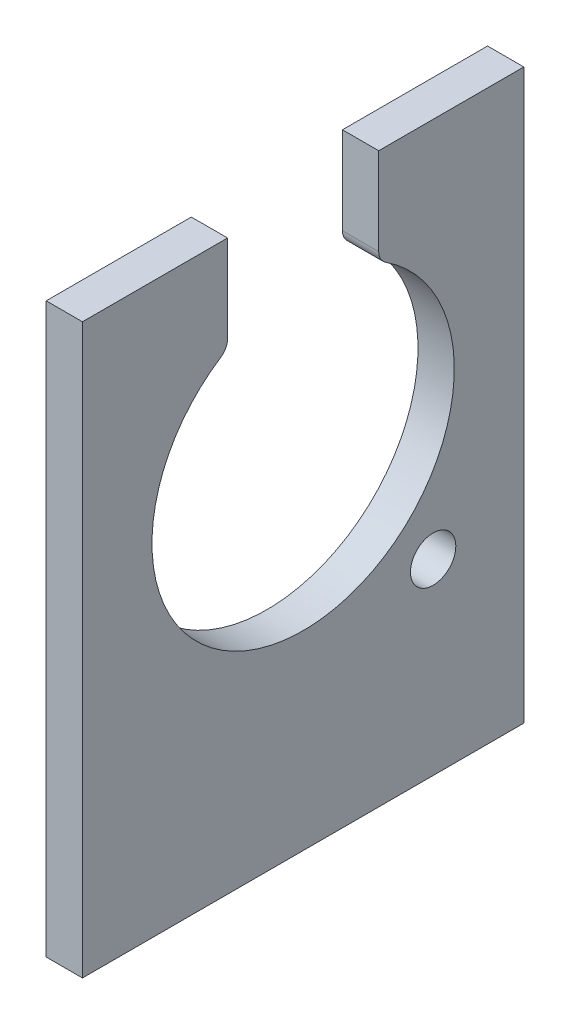
ISO-10303-21;
HEADER;
FILE_DESCRIPTION(('STEP AP214'),'2;1');
FILE_NAME('part.step','',(''),(''),'','','');
FILE_SCHEMA(('AUTOMOTIVE_DESIGN { 1 0 10303 214 1 1 1 1 }'));
ENDSEC;
DATA;
#1=APPLICATION_CONTEXT('core data for automotive mechanical design processes');
#2=APPLICATION_PROTOCOL_DEFINITION('international standard','automotive_design',2000,#1);
#3=PRODUCT_CONTEXT('',#1,'mechanical');
#4=PRODUCT('Part','Part','',(#3));
#5=PRODUCT_RELATED_PRODUCT_CATEGORY('part','',(#4));
#6=PRODUCT_DEFINITION_FORMATION('','',#4);
#7=PRODUCT_DEFINITION_CONTEXT('part definition',#1,'design');
#8=PRODUCT_DEFINITION('design','',#6,#7);
#9=PRODUCT_DEFINITION_SHAPE('','',#8);
#10=(LENGTH_UNIT() NAMED_UNIT(*) SI_UNIT(.MILLI.,.METRE.));
#11=(NAMED_UNIT(*) PLANE_ANGLE_UNIT() SI_UNIT($,.RADIAN.));
#12=(NAMED_UNIT(*) SI_UNIT($,.STERADIAN.) SOLID_ANGLE_UNIT());
#13=UNCERTAINTY_MEASURE_WITH_UNIT(LENGTH_MEASURE(1.E-05),#10,'distance_accuracy_value','');
#14=(GEOMETRIC_REPRESENTATION_CONTEXT(3) GLOBAL_UNCERTAINTY_ASSIGNED_CONTEXT((#13)) GLOBAL_UNIT_ASSIGNED_CONTEXT((#10,
#11,#12)) REPRESENTATION_CONTEXT('',''));
#15=CARTESIAN_POINT('',(0.,0.,0.));
#16=DIRECTION('',(0.,0.,1.));
#17=DIRECTION('',(1.,0.,0.));
#18=AXIS2_PLACEMENT_3D('',#15,#16,#17);
#19=CARTESIAN_POINT('',(12.,94.,73.));
#20=DIRECTION('',(0.,0.,-1.));
#21=DIRECTION('',(0.,1.,0.));
#22=AXIS2_PLACEMENT_3D('',#19,#20,#21);
#23=PLANE('',#22);
#24=DIRECTION('',(0.,-1.,0.));
#25=VECTOR('',#24,1.);
#26=CARTESIAN_POINT('',(0.,94.,73.));
#27=LINE('',#26,#25);
#28=CARTESIAN_POINT('',(0.,94.,73.));
#29=VERTEX_POINT('',#28);
#30=CARTESIAN_POINT('',(0.,-94.,73.));
#31=VERTEX_POINT('',#30);
#32=EDGE_CURVE('E145',#29,#31,#27,.T.);
#33=ORIENTED_EDGE('',*,*,#32,.T.);
#34=DIRECTION('',(-1.,0.,0.));
#35=VECTOR('',#34,1.);
#36=CARTESIAN_POINT('',(12.,-94.,73.));
#37=LINE('',#36,#35);
#38=CARTESIAN_POINT('',(12.,-94.,73.));
#39=VERTEX_POINT('',#38);
#40=EDGE_CURVE('E11',#39,#31,#37,.T.);
#41=ORIENTED_EDGE('',*,*,#40,.F.);
#42=DIRECTION('',(0.,-1.,0.));
#43=VECTOR('',#42,1.);
#44=CARTESIAN_POINT('',(12.,94.,73.));
#45=LINE('',#44,#43);
#46=CARTESIAN_POINT('',(12.,94.,73.));
#47=VERTEX_POINT('',#46);
#48=EDGE_CURVE('E164',#47,#39,#45,.T.);
#49=ORIENTED_EDGE('',*,*,#48,.F.);
#50=DIRECTION('',(-1.,0.,0.));
#51=VECTOR('',#50,1.);
#52=CARTESIAN_POINT('',(12.,94.,73.));
#53=LINE('',#52,#51);
#54=EDGE_CURVE('E141',#47,#29,#53,.T.);
#55=ORIENTED_EDGE('',*,*,#54,.T.);
#56=EDGE_LOOP('',(#33,#41,#49,#55));
#57=FACE_BOUND('',#56,.T.);
#58=ADVANCED_FACE('F37',(#57),#23,.F.);
#59=CARTESIAN_POINT('',(12.,-94.,-73.));
#60=DIRECTION('',(0.,1.,0.));
#61=DIRECTION('',(0.,0.,1.));
#62=AXIS2_PLACEMENT_3D('',#59,#60,#61);
#63=PLANE('',#62);
#64=DIRECTION('',(0.,0.,-1.));
#65=VECTOR('',#64,1.);
#66=CARTESIAN_POINT('',(0.,-94.,-73.));
#67=LINE('',#66,#65);
#68=CARTESIAN_POINT('',(0.,-94.,-73.));
#69=VERTEX_POINT('',#68);
#70=EDGE_CURVE('E148',#31,#69,#67,.T.);
#71=ORIENTED_EDGE('',*,*,#70,.T.);
#72=DIRECTION('',(-1.,0.,0.));
#73=VECTOR('',#72,1.);
#74=CARTESIAN_POINT('',(12.,-94.,-73.));
#75=LINE('',#74,#73);
#76=CARTESIAN_POINT('',(12.,-94.,-73.));
#77=VERTEX_POINT('',#76);
#78=EDGE_CURVE('E45',#77,#69,#75,.T.);
#79=ORIENTED_EDGE('',*,*,#78,.F.);
#80=DIRECTION('',(0.,0.,-1.));
#81=VECTOR('',#80,1.);
#82=CARTESIAN_POINT('',(12.,-94.,-73.));
#83=LINE('',#82,#81);
#84=EDGE_CURVE('E102',#39,#77,#83,.T.);
#85=ORIENTED_EDGE('',*,*,#84,.F.);
#86=ORIENTED_EDGE('',*,*,#40,.T.);
#87=EDGE_LOOP('',(#71,#79,#85,#86));
#88=FACE_BOUND('',#87,.T.);
#89=ADVANCED_FACE('F234',(#88),#63,.F.);
#90=CARTESIAN_POINT('',(12.,94.,-73.));
#91=DIRECTION('',(0.,0.,1.));
#92=DIRECTION('',(0.,-1.,0.));
#93=AXIS2_PLACEMENT_3D('',#90,#91,#92);
#94=PLANE('',#93);
#95=DIRECTION('',(0.,1.,0.));
#96=VECTOR('',#95,1.);
#97=CARTESIAN_POINT('',(0.,94.,-73.));
#98=LINE('',#97,#96);
#99=CARTESIAN_POINT('',(0.,94.,-73.));
#100=VERTEX_POINT('',#99);
#101=EDGE_CURVE('E151',#69,#100,#98,.T.);
#102=ORIENTED_EDGE('',*,*,#101,.T.);
#103=DIRECTION('',(-1.,0.,0.));
#104=VECTOR('',#103,1.);
#105=CARTESIAN_POINT('',(12.,94.,-73.));
#106=LINE('',#105,#104);
#107=CARTESIAN_POINT('',(12.,94.,-73.));
#108=VERTEX_POINT('',#107);
#109=EDGE_CURVE('E177',#108,#100,#106,.T.);
#110=ORIENTED_EDGE('',*,*,#109,.F.);
#111=DIRECTION('',(0.,1.,0.));
#112=VECTOR('',#111,1.);
#113=CARTESIAN_POINT('',(12.,94.,-73.));
#114=LINE('',#113,#112);
#115=EDGE_CURVE('E185',#77,#108,#114,.T.);
#116=ORIENTED_EDGE('',*,*,#115,.F.);
#117=ORIENTED_EDGE('',*,*,#78,.T.);
#118=EDGE_LOOP('',(#102,#110,#116,#117));
#119=FACE_BOUND('',#118,.T.);
#120=ADVANCED_FACE('F183',(#119),#94,.F.);
#121=CARTESIAN_POINT('',(12.,94.,-73.));
#122=DIRECTION('',(0.,-1.,0.));
#123=DIRECTION('',(0.,0.,-1.));
#124=AXIS2_PLACEMENT_3D('',#121,#122,#123);
#125=PLANE('',#124);
#126=DIRECTION('',(0.,0.,1.));
#127=VECTOR('',#126,1.);
#128=CARTESIAN_POINT('',(0.,94.,-73.));
#129=LINE('',#128,#127);
#130=CARTESIAN_POINT('',(0.,94.,-25.));
#131=VERTEX_POINT('',#130);
#132=EDGE_CURVE('E153',#100,#131,#129,.T.);
#133=ORIENTED_EDGE('',*,*,#132,.T.);
#134=DIRECTION('',(-1.,0.,0.));
#135=VECTOR('',#134,1.);
#136=CARTESIAN_POINT('',(12.,94.,-25.));
#137=LINE('',#136,#135);
#138=CARTESIAN_POINT('',(12.,94.,-25.));
#139=VERTEX_POINT('',#138);
#140=EDGE_CURVE('E174',#139,#131,#137,.T.);
#141=ORIENTED_EDGE('',*,*,#140,.F.);
#142=DIRECTION('',(0.,0.,1.));
#143=VECTOR('',#142,1.);
#144=CARTESIAN_POINT('',(12.,94.,-73.));
#145=LINE('',#144,#143);
#146=EDGE_CURVE('E203',#108,#139,#145,.T.);
#147=ORIENTED_EDGE('',*,*,#146,.F.);
#148=ORIENTED_EDGE('',*,*,#109,.T.);
#149=EDGE_LOOP('',(#133,#141,#147,#148));
#150=FACE_BOUND('',#149,.T.);
#151=ADVANCED_FACE('F194',(#150),#125,.F.);
#152=CARTESIAN_POINT('',(12.,94.,-25.));
#153=DIRECTION('',(0.,0.,-1.));
#154=DIRECTION('',(0.,1.,0.));
#155=AXIS2_PLACEMENT_3D('',#152,#153,#154);
#156=PLANE('',#155);
#157=DIRECTION('',(0.,-1.,0.));
#158=VECTOR('',#157,1.);
#159=CARTESIAN_POINT('',(0.,94.,-25.));
#160=LINE('',#159,#158);
#161=CARTESIAN_POINT('',(0.,65.0977222864644,-25.));
#162=VERTEX_POINT('',#161);
#163=EDGE_CURVE('E155',#131,#162,#160,.T.);
#164=ORIENTED_EDGE('',*,*,#163,.T.);
#165=DIRECTION('',(-1.,0.,0.));
#166=VECTOR('',#165,1.);
#167=CARTESIAN_POINT('',(12.,65.0977222864644,-25.));
#168=LINE('',#167,#166);
#169=CARTESIAN_POINT('',(12.,65.0977222864644,-25.));
#170=VERTEX_POINT('',#169);
#171=EDGE_CURVE('E171',#170,#162,#168,.T.);
#172=ORIENTED_EDGE('',*,*,#171,.F.);
#173=DIRECTION('',(0.,-1.,0.));
#174=VECTOR('',#173,1.);
#175=CARTESIAN_POINT('',(12.,94.,-25.));
#176=LINE('',#175,#174);
#177=EDGE_CURVE('E200',#139,#170,#176,.T.);
#178=ORIENTED_EDGE('',*,*,#177,.F.);
#179=ORIENTED_EDGE('',*,*,#140,.T.);
#180=EDGE_LOOP('',(#164,#172,#178,#179));
#181=FACE_BOUND('',#180,.T.);
#182=ADVANCED_FACE('F198',(#181),#156,.F.);
#183=CARTESIAN_POINT('',(12.,65.0977222864644,-30.));
#184=DIRECTION('',(-1.,0.,0.));
#185=DIRECTION('',(0.,0.,1.));
#186=AXIS2_PLACEMENT_3D('',#183,#184,#185);
#187=CYLINDRICAL_SURFACE('',#186,5.);
#188=CARTESIAN_POINT('',(0.,65.0977222864644,-30.));
#189=DIRECTION('',(1.,0.,0.));
#190=DIRECTION('',(0.,0.,-1.));
#191=AXIS2_PLACEMENT_3D('',#188,#189,#190);
#192=CIRCLE('',#191,5.);
#193=CARTESIAN_POINT('',(0.,60.9070202604222,-27.2727272727273));
#194=VERTEX_POINT('',#193);
#195=EDGE_CURVE('E157',#162,#194,#192,.T.);
#196=ORIENTED_EDGE('',*,*,#195,.T.);
#197=DIRECTION('',(-1.,0.,0.));
#198=VECTOR('',#197,1.);
#199=CARTESIAN_POINT('',(12.,60.9070202604222,-27.2727272727273));
#200=LINE('',#199,#198);
#201=CARTESIAN_POINT('',(12.,60.9070202604222,-27.2727272727273));
#202=VERTEX_POINT('',#201);
#203=EDGE_CURVE('E168',#202,#194,#200,.T.);
#204=ORIENTED_EDGE('',*,*,#203,.F.);
#205=CARTESIAN_POINT('',(12.,65.0977222864644,-30.));
#206=DIRECTION('',(1.,0.,0.));
#207=DIRECTION('',(0.,0.,-1.));
#208=AXIS2_PLACEMENT_3D('',#205,#206,#207);
#209=CIRCLE('',#208,5.);
#210=EDGE_CURVE('E202',#170,#202,#209,.T.);
#211=ORIENTED_EDGE('',*,*,#210,.F.);
#212=ORIENTED_EDGE('',*,*,#171,.T.);
#213=EDGE_LOOP('',(#196,#204,#211,#212));
#214=FACE_BOUND('',#213,.T.);
#215=ADVANCED_FACE('F246',(#214),#187,.T.);
#216=CARTESIAN_POINT('',(12.,19.,0.));
#217=DIRECTION('',(-1.,0.,0.));
#218=DIRECTION('',(0.,0.,1.));
#219=AXIS2_PLACEMENT_3D('',#216,#217,#218);
#220=CYLINDRICAL_SURFACE('',#219,50.);
#221=CARTESIAN_POINT('',(0.,19.,0.));
#222=DIRECTION('',(-1.,0.,0.));
#223=DIRECTION('',(0.,0.,-1.));
#224=AXIS2_PLACEMENT_3D('',#221,#222,#223);
#225=CIRCLE('',#224,50.);
#226=CARTESIAN_POINT('',(0.,60.9070202604222,27.2727272727272));
#227=VERTEX_POINT('',#226);
#228=EDGE_CURVE('E159',#194,#227,#225,.T.);
#229=ORIENTED_EDGE('',*,*,#228,.T.);
#230=DIRECTION('',(-1.,0.,0.));
#231=VECTOR('',#230,1.);
#232=CARTESIAN_POINT('',(12.,60.9070202604222,27.2727272727272));
#233=LINE('',#232,#231);
#234=CARTESIAN_POINT('',(12.,60.9070202604222,27.2727272727272));
#235=VERTEX_POINT('',#234);
#236=EDGE_CURVE('E136',#235,#227,#233,.T.);
#237=ORIENTED_EDGE('',*,*,#236,.F.);
#238=CARTESIAN_POINT('',(12.,19.,0.));
#239=DIRECTION('',(-1.,0.,0.));
#240=DIRECTION('',(0.,0.,-1.));
#241=AXIS2_PLACEMENT_3D('',#238,#239,#240);
#242=CIRCLE('',#241,50.);
#243=EDGE_CURVE('E127',#202,#235,#242,.T.);
#244=ORIENTED_EDGE('',*,*,#243,.F.);
#245=ORIENTED_EDGE('',*,*,#203,.T.);
#246=EDGE_LOOP('',(#229,#237,#244,#245));
#247=FACE_BOUND('',#246,.T.);
#248=ADVANCED_FACE('F243',(#247),#220,.F.);
#249=CARTESIAN_POINT('',(12.,65.0977222864644,30.));
#250=DIRECTION('',(-1.,0.,0.));
#251=DIRECTION('',(0.,0.,1.));
#252=AXIS2_PLACEMENT_3D('',#249,#250,#251);
#253=CYLINDRICAL_SURFACE('',#252,5.);
#254=CARTESIAN_POINT('',(0.,65.0977222864644,30.));
#255=DIRECTION('',(1.,0.,0.));
#256=DIRECTION('',(0.,0.,1.));
#257=AXIS2_PLACEMENT_3D('',#254,#255,#256);
#258=CIRCLE('',#257,5.);
#259=CARTESIAN_POINT('',(0.,65.0977222864644,25.));
#260=VERTEX_POINT('',#259);
#261=EDGE_CURVE('E135',#227,#260,#258,.T.);
#262=ORIENTED_EDGE('',*,*,#261,.T.);
#263=DIRECTION('',(-1.,0.,0.));
#264=VECTOR('',#263,1.);
#265=CARTESIAN_POINT('',(12.,65.0977222864644,25.));
#266=LINE('',#265,#264);
#267=CARTESIAN_POINT('',(12.,65.0977222864644,25.));
#268=VERTEX_POINT('',#267);
#269=EDGE_CURVE('E132',#268,#260,#266,.T.);
#270=ORIENTED_EDGE('',*,*,#269,.F.);
#271=CARTESIAN_POINT('',(12.,65.0977222864644,30.));
#272=DIRECTION('',(1.,0.,0.));
#273=DIRECTION('',(0.,0.,1.));
#274=AXIS2_PLACEMENT_3D('',#271,#272,#273);
#275=CIRCLE('',#274,5.);
#276=EDGE_CURVE('E121',#235,#268,#275,.T.);
#277=ORIENTED_EDGE('',*,*,#276,.F.);
#278=ORIENTED_EDGE('',*,*,#236,.T.);
#279=EDGE_LOOP('',(#262,#270,#277,#278));
#280=FACE_BOUND('',#279,.T.);
#281=ADVANCED_FACE('F133',(#280),#253,.T.);
#282=CARTESIAN_POINT('',(12.,94.,25.));
#283=DIRECTION('',(0.,0.,1.));
#284=DIRECTION('',(0.,-1.,0.));
#285=AXIS2_PLACEMENT_3D('',#282,#283,#284);
#286=PLANE('',#285);
#287=DIRECTION('',(0.,1.,0.));
#288=VECTOR('',#287,1.);
#289=CARTESIAN_POINT('',(0.,94.,25.));
#290=LINE('',#289,#288);
#291=CARTESIAN_POINT('',(0.,94.,25.));
#292=VERTEX_POINT('',#291);
#293=EDGE_CURVE('E88',#260,#292,#290,.T.);
#294=ORIENTED_EDGE('',*,*,#293,.T.);
#295=DIRECTION('',(-1.,0.,0.));
#296=VECTOR('',#295,1.);
#297=CARTESIAN_POINT('',(12.,94.,25.));
#298=LINE('',#297,#296);
#299=CARTESIAN_POINT('',(12.,94.,25.));
#300=VERTEX_POINT('',#299);
#301=EDGE_CURVE('E137',#300,#292,#298,.T.);
#302=ORIENTED_EDGE('',*,*,#301,.F.);
#303=DIRECTION('',(0.,1.,0.));
#304=VECTOR('',#303,1.);
#305=CARTESIAN_POINT('',(12.,94.,25.));
#306=LINE('',#305,#304);
#307=EDGE_CURVE('E125',#268,#300,#306,.T.);
#308=ORIENTED_EDGE('',*,*,#307,.F.);
#309=ORIENTED_EDGE('',*,*,#269,.T.);
#310=EDGE_LOOP('',(#294,#302,#308,#309));
#311=FACE_BOUND('',#310,.T.);
#312=ADVANCED_FACE('F139',(#311),#286,.F.);
#313=CARTESIAN_POINT('',(12.,94.,25.));
#314=DIRECTION('',(0.,-1.,0.));
#315=DIRECTION('',(0.,0.,-1.));
#316=AXIS2_PLACEMENT_3D('',#313,#314,#315);
#317=PLANE('',#316);
#318=DIRECTION('',(0.,0.,1.));
#319=VECTOR('',#318,1.);
#320=CARTESIAN_POINT('',(0.,94.,25.));
#321=LINE('',#320,#319);
#322=EDGE_CURVE('E94',#292,#29,#321,.T.);
#323=ORIENTED_EDGE('',*,*,#322,.T.);
#324=ORIENTED_EDGE('',*,*,#54,.F.);
#325=DIRECTION('',(0.,0.,1.));
#326=VECTOR('',#325,1.);
#327=CARTESIAN_POINT('',(12.,94.,25.));
#328=LINE('',#327,#326);
#329=EDGE_CURVE('E53',#300,#47,#328,.T.);
#330=ORIENTED_EDGE('',*,*,#329,.F.);
#331=ORIENTED_EDGE('',*,*,#301,.T.);
#332=EDGE_LOOP('',(#323,#324,#330,#331));
#333=FACE_BOUND('',#332,.T.);
#334=ADVANCED_FACE('F225',(#333),#317,.F.);
#335=CARTESIAN_POINT('',(12.,65.0977222864644,-30.));
#336=DIRECTION('',(1.,0.,0.));
#337=DIRECTION('',(0.,0.,-1.));
#338=AXIS2_PLACEMENT_3D('',#335,#336,#337);
#339=PLANE('',#338);
#340=CARTESIAN_POINT('',(12.,-32.,-43.));
#341=DIRECTION('',(1.,0.,0.));
#342=DIRECTION('',(0.,0.,-1.));
#343=AXIS2_PLACEMENT_3D('',#340,#341,#342);
#344=CIRCLE('',#343,7.5);
#345=CARTESIAN_POINT('',(12.,-32.,-50.5));
#346=VERTEX_POINT('',#345);
#347=EDGE_CURVE('E211',#346,#346,#344,.T.);
#348=ORIENTED_EDGE('',*,*,#347,.F.);
#349=EDGE_LOOP('',(#348));
#350=FACE_BOUND('',#349,.T.);
#351=ORIENTED_EDGE('',*,*,#48,.T.);
#352=ORIENTED_EDGE('',*,*,#84,.T.);
#353=ORIENTED_EDGE('',*,*,#115,.T.);
#354=ORIENTED_EDGE('',*,*,#146,.T.);
#355=ORIENTED_EDGE('',*,*,#177,.T.);
#356=ORIENTED_EDGE('',*,*,#210,.T.);
#357=ORIENTED_EDGE('',*,*,#243,.T.);
#358=ORIENTED_EDGE('',*,*,#276,.T.);
#359=ORIENTED_EDGE('',*,*,#307,.T.);
#360=ORIENTED_EDGE('',*,*,#329,.T.);
#361=EDGE_LOOP('',(#351,#352,#353,#354,#355,#356,#357,#358,#359,#360));
#362=FACE_BOUND('',#361,.T.);
#363=ADVANCED_FACE('F123',(#350,#362),#339,.T.);
#364=CARTESIAN_POINT('',(0.,65.0977222864644,-30.));
#365=DIRECTION('',(1.,0.,0.));
#366=DIRECTION('',(0.,0.,-1.));
#367=AXIS2_PLACEMENT_3D('',#364,#365,#366);
#368=PLANE('',#367);
#369=CARTESIAN_POINT('',(0.,-32.,-43.));
#370=DIRECTION('',(1.,0.,0.));
#371=DIRECTION('',(0.,0.,-1.));
#372=AXIS2_PLACEMENT_3D('',#369,#370,#371);
#373=CIRCLE('',#372,7.5);
#374=CARTESIAN_POINT('',(0.,-32.,-50.5));
#375=VERTEX_POINT('',#374);
#376=EDGE_CURVE('E149',#375,#375,#373,.T.);
#377=ORIENTED_EDGE('',*,*,#376,.T.);
#378=EDGE_LOOP('',(#377));
#379=FACE_BOUND('',#378,.T.);
#380=ORIENTED_EDGE('',*,*,#32,.F.);
#381=ORIENTED_EDGE('',*,*,#322,.F.);
#382=ORIENTED_EDGE('',*,*,#293,.F.);
#383=ORIENTED_EDGE('',*,*,#261,.F.);
#384=ORIENTED_EDGE('',*,*,#228,.F.);
#385=ORIENTED_EDGE('',*,*,#195,.F.);
#386=ORIENTED_EDGE('',*,*,#163,.F.);
#387=ORIENTED_EDGE('',*,*,#132,.F.);
#388=ORIENTED_EDGE('',*,*,#101,.F.);
#389=ORIENTED_EDGE('',*,*,#70,.F.);
#390=EDGE_LOOP('',(#380,#381,#382,#383,#384,#385,#386,#387,#388,#389));
#391=FACE_BOUND('',#390,.T.);
#392=ADVANCED_FACE('F189',(#379,#391),#368,.F.);
#393=CARTESIAN_POINT('',(0.,-32.,-43.));
#394=DIRECTION('',(1.,0.,0.));
#395=DIRECTION('',(0.,0.,-1.));
#396=AXIS2_PLACEMENT_3D('',#393,#394,#395);
#397=CYLINDRICAL_SURFACE('',#396,7.5);
#398=ORIENTED_EDGE('',*,*,#376,.F.);
#399=EDGE_LOOP('',(#398));
#400=FACE_BOUND('',#399,.T.);
#401=ORIENTED_EDGE('',*,*,#347,.T.);
#402=EDGE_LOOP('',(#401));
#403=FACE_BOUND('',#402,.T.);
#404=ADVANCED_FACE('F218',(#400,#403),#397,.F.);
#405=CLOSED_SHELL('',(#58,#89,#120,#151,#182,#215,#248,#281,#312,#334,#363,#392,#404));
#406=MANIFOLD_SOLID_BREP('B2',#405);
#407=ADVANCED_BREP_SHAPE_REPRESENTATION('',(#18,#406),#14);
#408=SHAPE_DEFINITION_REPRESENTATION(#9,#407);
ENDSEC;
END-ISO-10303-21;
